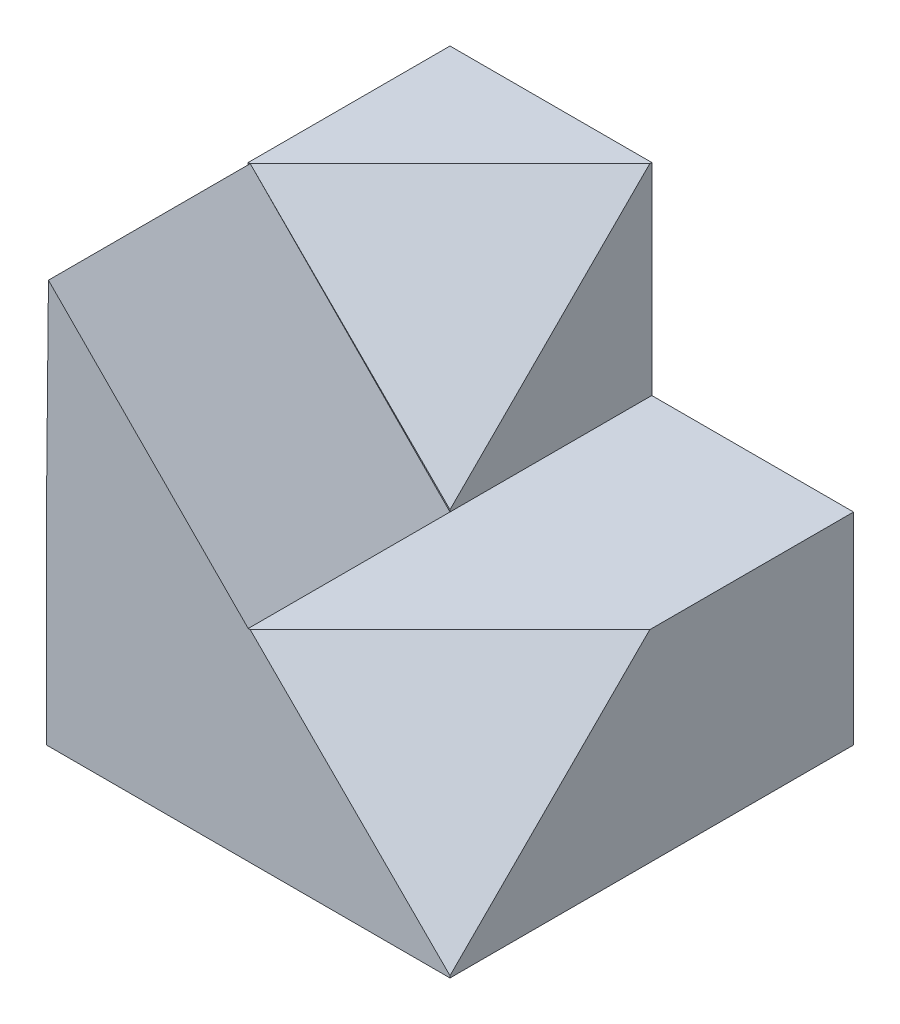
ISO-10303-21;
HEADER;
FILE_DESCRIPTION(('STEP AP214'),'2;1');
FILE_NAME('part.step','',(''),(''),'','','');
FILE_SCHEMA(('AUTOMOTIVE_DESIGN { 1 0 10303 214 1 1 1 1 }'));
ENDSEC;
DATA;
#1=APPLICATION_CONTEXT('core data for automotive mechanical design processes');
#2=APPLICATION_PROTOCOL_DEFINITION('international standard','automotive_design',2000,#1);
#3=PRODUCT_CONTEXT('',#1,'mechanical');
#4=PRODUCT('Part','Part','',(#3));
#5=PRODUCT_RELATED_PRODUCT_CATEGORY('part','',(#4));
#6=PRODUCT_DEFINITION_FORMATION('','',#4);
#7=PRODUCT_DEFINITION_CONTEXT('part definition',#1,'design');
#8=PRODUCT_DEFINITION('design','',#6,#7);
#9=PRODUCT_DEFINITION_SHAPE('','',#8);
#10=(LENGTH_UNIT() NAMED_UNIT(*) SI_UNIT(.MILLI.,.METRE.));
#11=(NAMED_UNIT(*) PLANE_ANGLE_UNIT() SI_UNIT($,.RADIAN.));
#12=(NAMED_UNIT(*) SI_UNIT($,.STERADIAN.) SOLID_ANGLE_UNIT());
#13=UNCERTAINTY_MEASURE_WITH_UNIT(LENGTH_MEASURE(1.E-05),#10,'distance_accuracy_value','');
#14=(GEOMETRIC_REPRESENTATION_CONTEXT(3) GLOBAL_UNCERTAINTY_ASSIGNED_CONTEXT((#13)) GLOBAL_UNIT_ASSIGNED_CONTEXT((#10,
#11,#12)) REPRESENTATION_CONTEXT('',''));
#15=CARTESIAN_POINT('',(0.,0.,0.));
#16=DIRECTION('',(0.,0.,1.));
#17=DIRECTION('',(1.,0.,0.));
#18=AXIS2_PLACEMENT_3D('',#15,#16,#17);
#19=CARTESIAN_POINT('',(0.,20.,0.));
#20=DIRECTION('',(0.,1.,0.));
#21=DIRECTION('',(0.,0.,1.));
#22=AXIS2_PLACEMENT_3D('',#19,#20,#21);
#23=PLANE('',#22);
#24=DIRECTION('',(1.,0.,0.));
#25=VECTOR('',#24,1.);
#26=CARTESIAN_POINT('',(-20.,20.,20.));
#27=LINE('',#26,#25);
#28=CARTESIAN_POINT('',(0.,20.,20.));
#29=VERTEX_POINT('',#28);
#30=CARTESIAN_POINT('',(0.200000000000014,20.,20.));
#31=VERTEX_POINT('',#30);
#32=EDGE_CURVE('E123',#29,#31,#27,.T.);
#33=ORIENTED_EDGE('',*,*,#32,.T.);
#34=DIRECTION('',(0.707106781186547,0.,-0.707106781186547));
#35=VECTOR('',#34,1.);
#36=CARTESIAN_POINT('',(10.1,20.,10.1));
#37=LINE('',#36,#35);
#38=CARTESIAN_POINT('',(20.,20.,0.200000000000017));
#39=VERTEX_POINT('',#38);
#40=EDGE_CURVE('E11',#31,#39,#37,.T.);
#41=ORIENTED_EDGE('',*,*,#40,.T.);
#42=DIRECTION('',(0.,0.,-1.));
#43=VECTOR('',#42,1.);
#44=CARTESIAN_POINT('',(20.,20.,-20.));
#45=LINE('',#44,#43);
#46=CARTESIAN_POINT('',(20.,20.,-20.));
#47=VERTEX_POINT('',#46);
#48=EDGE_CURVE('E146',#39,#47,#45,.T.);
#49=ORIENTED_EDGE('',*,*,#48,.T.);
#50=DIRECTION('',(-1.,0.,0.));
#51=VECTOR('',#50,1.);
#52=CARTESIAN_POINT('',(-20.,20.,-20.));
#53=LINE('',#52,#51);
#54=CARTESIAN_POINT('',(0.,20.,-20.));
#55=VERTEX_POINT('',#54);
#56=EDGE_CURVE('E133',#47,#55,#53,.T.);
#57=ORIENTED_EDGE('',*,*,#56,.T.);
#58=DIRECTION('',(0.,0.,-1.));
#59=VECTOR('',#58,1.);
#60=CARTESIAN_POINT('',(0.,20.,-20.));
#61=LINE('',#60,#59);
#62=CARTESIAN_POINT('',(0.,20.,0.));
#63=VERTEX_POINT('',#62);
#64=EDGE_CURVE('E186',#63,#55,#61,.T.);
#65=ORIENTED_EDGE('',*,*,#64,.F.);
#66=DIRECTION('',(0.,0.,1.));
#67=VECTOR('',#66,1.);
#68=CARTESIAN_POINT('',(0.,20.,0.));
#69=LINE('',#68,#67);
#70=EDGE_CURVE('E128',#63,#29,#69,.T.);
#71=ORIENTED_EDGE('',*,*,#70,.T.);
#72=EDGE_LOOP('',(#33,#41,#49,#57,#65,#71));
#73=FACE_BOUND('',#72,.T.);
#74=ADVANCED_FACE('F39',(#73),#23,.T.);
#75=CARTESIAN_POINT('',(-20.,40.,0.));
#76=DIRECTION('',(0.,0.,-1.));
#77=DIRECTION('',(-1.,0.,0.));
#78=AXIS2_PLACEMENT_3D('',#75,#76,#77);
#79=PLANE('',#78);
#80=DIRECTION('',(0.,-1.,0.));
#81=VECTOR('',#80,1.);
#82=CARTESIAN_POINT('',(-20.,40.,0.));
#83=LINE('',#82,#81);
#84=CARTESIAN_POINT('',(-20.,40.,0.));
#85=VERTEX_POINT('',#84);
#86=CARTESIAN_POINT('',(-20.,20.,0.));
#87=VERTEX_POINT('',#86);
#88=EDGE_CURVE('E141',#85,#87,#83,.T.);
#89=ORIENTED_EDGE('',*,*,#88,.T.);
#90=DIRECTION('',(-0.00999950003749681,-0.999950003749688,0.));
#91=VECTOR('',#90,1.);
#92=CARTESIAN_POINT('',(-20.,20.,0.));
#93=LINE('',#92,#91);
#94=CARTESIAN_POINT('',(-19.8,40.,0.));
#95=VERTEX_POINT('',#94);
#96=EDGE_CURVE('E210',#95,#87,#93,.T.);
#97=ORIENTED_EDGE('',*,*,#96,.F.);
#98=DIRECTION('',(1.,0.,0.));
#99=VECTOR('',#98,1.);
#100=CARTESIAN_POINT('',(-20.,40.,0.));
#101=LINE('',#100,#99);
#102=EDGE_CURVE('E169',#85,#95,#101,.T.);
#103=ORIENTED_EDGE('',*,*,#102,.F.);
#104=EDGE_LOOP('',(#89,#97,#103));
#105=FACE_BOUND('',#104,.T.);
#106=ADVANCED_FACE('F222',(#105),#79,.F.);
#107=CARTESIAN_POINT('',(0.,40.,0.));
#108=DIRECTION('',(0.,1.,0.));
#109=DIRECTION('',(0.,0.,1.));
#110=AXIS2_PLACEMENT_3D('',#107,#108,#109);
#111=PLANE('',#110);
#112=ORIENTED_EDGE('',*,*,#102,.T.);
#113=DIRECTION('',(0.707106781186547,0.,-0.707106781186547));
#114=VECTOR('',#113,1.);
#115=CARTESIAN_POINT('',(-9.9,40.,-9.9));
#116=LINE('',#115,#114);
#117=CARTESIAN_POINT('',(0.,40.,-19.8));
#118=VERTEX_POINT('',#117);
#119=EDGE_CURVE('E159',#95,#118,#116,.T.);
#120=ORIENTED_EDGE('',*,*,#119,.T.);
#121=DIRECTION('',(0.,0.,-1.));
#122=VECTOR('',#121,1.);
#123=CARTESIAN_POINT('',(0.,40.,-20.));
#124=LINE('',#123,#122);
#125=CARTESIAN_POINT('',(0.,40.,-20.));
#126=VERTEX_POINT('',#125);
#127=EDGE_CURVE('E166',#118,#126,#124,.T.);
#128=ORIENTED_EDGE('',*,*,#127,.T.);
#129=DIRECTION('',(-1.,0.,0.));
#130=VECTOR('',#129,1.);
#131=CARTESIAN_POINT('',(-20.,40.,-20.));
#132=LINE('',#131,#130);
#133=CARTESIAN_POINT('',(-20.,40.,-20.));
#134=VERTEX_POINT('',#133);
#135=EDGE_CURVE('E179',#126,#134,#132,.T.);
#136=ORIENTED_EDGE('',*,*,#135,.T.);
#137=DIRECTION('',(0.,0.,1.));
#138=VECTOR('',#137,1.);
#139=CARTESIAN_POINT('',(-20.,40.,-20.));
#140=LINE('',#139,#138);
#141=EDGE_CURVE('E182',#134,#85,#140,.T.);
#142=ORIENTED_EDGE('',*,*,#141,.T.);
#143=EDGE_LOOP('',(#112,#120,#128,#136,#142));
#144=FACE_BOUND('',#143,.T.);
#145=ADVANCED_FACE('F164',(#144),#111,.T.);
#146=CARTESIAN_POINT('',(20.,20.,-20.));
#147=DIRECTION('',(-1.,0.,0.));
#148=DIRECTION('',(0.,0.,1.));
#149=AXIS2_PLACEMENT_3D('',#146,#147,#148);
#150=PLANE('',#149);
#151=DIRECTION('',(0.,0.707106781186548,-0.707106781186547));
#152=VECTOR('',#151,1.);
#153=CARTESIAN_POINT('',(20.,30.1,-9.89999999999999));
#154=LINE('',#153,#152);
#155=CARTESIAN_POINT('',(20.,0.200000000000002,20.));
#156=VERTEX_POINT('',#155);
#157=EDGE_CURVE('E54',#156,#39,#154,.T.);
#158=ORIENTED_EDGE('',*,*,#157,.F.);
#159=DIRECTION('',(0.,-1.,0.));
#160=VECTOR('',#159,1.);
#161=CARTESIAN_POINT('',(20.,20.,20.));
#162=LINE('',#161,#160);
#163=CARTESIAN_POINT('',(20.,0.,20.));
#164=VERTEX_POINT('',#163);
#165=EDGE_CURVE('E125',#156,#164,#162,.T.);
#166=ORIENTED_EDGE('',*,*,#165,.T.);
#167=DIRECTION('',(0.,0.,-1.));
#168=VECTOR('',#167,1.);
#169=CARTESIAN_POINT('',(20.,0.,-20.));
#170=LINE('',#169,#168);
#171=CARTESIAN_POINT('',(20.,0.,-20.));
#172=VERTEX_POINT('',#171);
#173=EDGE_CURVE('E137',#164,#172,#170,.T.);
#174=ORIENTED_EDGE('',*,*,#173,.T.);
#175=DIRECTION('',(0.,-1.,0.));
#176=VECTOR('',#175,1.);
#177=CARTESIAN_POINT('',(20.,20.,-20.));
#178=LINE('',#177,#176);
#179=EDGE_CURVE('E153',#47,#172,#178,.T.);
#180=ORIENTED_EDGE('',*,*,#179,.F.);
#181=ORIENTED_EDGE('',*,*,#48,.F.);
#182=EDGE_LOOP('',(#158,#166,#174,#180,#181));
#183=FACE_BOUND('',#182,.T.);
#184=ADVANCED_FACE('F41',(#183),#150,.F.);
#185=CARTESIAN_POINT('',(-20.,20.,-20.));
#186=DIRECTION('',(0.,0.,1.));
#187=DIRECTION('',(1.,0.,0.));
#188=AXIS2_PLACEMENT_3D('',#185,#186,#187);
#189=PLANE('',#188);
#190=DIRECTION('',(-1.,0.,0.));
#191=VECTOR('',#190,1.);
#192=CARTESIAN_POINT('',(-20.,0.,-20.));
#193=LINE('',#192,#191);
#194=CARTESIAN_POINT('',(-20.,0.,-20.));
#195=VERTEX_POINT('',#194);
#196=EDGE_CURVE('E140',#172,#195,#193,.T.);
#197=ORIENTED_EDGE('',*,*,#196,.T.);
#198=DIRECTION('',(0.,-1.,0.));
#199=VECTOR('',#198,1.);
#200=CARTESIAN_POINT('',(-20.,20.,-20.));
#201=LINE('',#200,#199);
#202=EDGE_CURVE('E150',#134,#195,#201,.T.);
#203=ORIENTED_EDGE('',*,*,#202,.F.);
#204=ORIENTED_EDGE('',*,*,#135,.F.);
#205=DIRECTION('',(0.,-1.,0.));
#206=VECTOR('',#205,1.);
#207=CARTESIAN_POINT('',(0.,40.,-20.));
#208=LINE('',#207,#206);
#209=EDGE_CURVE('E177',#126,#55,#208,.T.);
#210=ORIENTED_EDGE('',*,*,#209,.T.);
#211=ORIENTED_EDGE('',*,*,#56,.F.);
#212=ORIENTED_EDGE('',*,*,#179,.T.);
#213=EDGE_LOOP('',(#197,#203,#204,#210,#211,#212));
#214=FACE_BOUND('',#213,.T.);
#215=ADVANCED_FACE('F197',(#214),#189,.F.);
#216=CARTESIAN_POINT('',(-20.,20.,-20.));
#217=DIRECTION('',(1.,0.,0.));
#218=DIRECTION('',(0.,0.,-1.));
#219=AXIS2_PLACEMENT_3D('',#216,#217,#218);
#220=PLANE('',#219);
#221=DIRECTION('',(0.,0.,1.));
#222=VECTOR('',#221,1.);
#223=CARTESIAN_POINT('',(-20.,0.,-20.));
#224=LINE('',#223,#222);
#225=CARTESIAN_POINT('',(-20.,0.,20.));
#226=VERTEX_POINT('',#225);
#227=EDGE_CURVE('E143',#195,#226,#224,.T.);
#228=ORIENTED_EDGE('',*,*,#227,.T.);
#229=DIRECTION('',(0.,-1.,0.));
#230=VECTOR('',#229,1.);
#231=CARTESIAN_POINT('',(-20.,20.,20.));
#232=LINE('',#231,#230);
#233=CARTESIAN_POINT('',(-20.,20.,20.));
#234=VERTEX_POINT('',#233);
#235=EDGE_CURVE('E131',#234,#226,#232,.T.);
#236=ORIENTED_EDGE('',*,*,#235,.F.);
#237=DIRECTION('',(0.,0.,1.));
#238=VECTOR('',#237,1.);
#239=CARTESIAN_POINT('',(-20.,20.,-20.));
#240=LINE('',#239,#238);
#241=EDGE_CURVE('E129',#87,#234,#240,.T.);
#242=ORIENTED_EDGE('',*,*,#241,.F.);
#243=ORIENTED_EDGE('',*,*,#88,.F.);
#244=ORIENTED_EDGE('',*,*,#141,.F.);
#245=ORIENTED_EDGE('',*,*,#202,.T.);
#246=EDGE_LOOP('',(#228,#236,#242,#243,#244,#245));
#247=FACE_BOUND('',#246,.T.);
#248=ADVANCED_FACE('F201',(#247),#220,.F.);
#249=CARTESIAN_POINT('',(-20.,20.,20.));
#250=DIRECTION('',(0.,0.,-1.));
#251=DIRECTION('',(-1.,0.,0.));
#252=AXIS2_PLACEMENT_3D('',#249,#250,#251);
#253=PLANE('',#252);
#254=DIRECTION('',(0.707106781186548,-0.707106781186548,0.));
#255=VECTOR('',#254,1.);
#256=CARTESIAN_POINT('',(-9.9,30.1,20.));
#257=LINE('',#256,#255);
#258=EDGE_CURVE('E47',#31,#156,#257,.T.);
#259=ORIENTED_EDGE('',*,*,#258,.F.);
#260=ORIENTED_EDGE('',*,*,#32,.F.);
#261=DIRECTION('',(-0.703544597920105,0.710651109010207,0.));
#262=VECTOR('',#261,1.);
#263=CARTESIAN_POINT('',(-19.8,40.,20.));
#264=LINE('',#263,#262);
#265=CARTESIAN_POINT('',(-19.8,40.,20.));
#266=VERTEX_POINT('',#265);
#267=EDGE_CURVE('E208',#29,#266,#264,.T.);
#268=ORIENTED_EDGE('',*,*,#267,.T.);
#269=DIRECTION('',(-0.00999950003749681,-0.999950003749688,0.));
#270=VECTOR('',#269,1.);
#271=CARTESIAN_POINT('',(-20.,20.,20.));
#272=LINE('',#271,#270);
#273=EDGE_CURVE('E211',#266,#234,#272,.T.);
#274=ORIENTED_EDGE('',*,*,#273,.T.);
#275=ORIENTED_EDGE('',*,*,#235,.T.);
#276=DIRECTION('',(1.,0.,0.));
#277=VECTOR('',#276,1.);
#278=CARTESIAN_POINT('',(-20.,0.,20.));
#279=LINE('',#278,#277);
#280=EDGE_CURVE('E145',#226,#164,#279,.T.);
#281=ORIENTED_EDGE('',*,*,#280,.T.);
#282=ORIENTED_EDGE('',*,*,#165,.F.);
#283=EDGE_LOOP('',(#259,#260,#268,#274,#275,#281,#282));
#284=FACE_BOUND('',#283,.T.);
#285=ADVANCED_FACE('F121',(#284),#253,.F.);
#286=CARTESIAN_POINT('',(0.,0.,0.));
#287=DIRECTION('',(0.,1.,0.));
#288=DIRECTION('',(0.,0.,1.));
#289=AXIS2_PLACEMENT_3D('',#286,#287,#288);
#290=PLANE('',#289);
#291=ORIENTED_EDGE('',*,*,#173,.F.);
#292=ORIENTED_EDGE('',*,*,#280,.F.);
#293=ORIENTED_EDGE('',*,*,#227,.F.);
#294=ORIENTED_EDGE('',*,*,#196,.F.);
#295=EDGE_LOOP('',(#291,#292,#293,#294));
#296=FACE_BOUND('',#295,.T.);
#297=ADVANCED_FACE('F235',(#296),#290,.F.);
#298=DIRECTION('',(0.707106781186547,-0.707106781186547,0.));
#299=VECTOR('',#298,1.);
#300=CARTESIAN_POINT('',(-19.9,40.1,0.));
#301=LINE('',#300,#299);
#302=CARTESIAN_POINT('',(0.,20.2,0.));
#303=VERTEX_POINT('',#302);
#304=EDGE_CURVE('E156',#95,#303,#301,.T.);
#305=ORIENTED_EDGE('',*,*,#304,.F.);
#306=DIRECTION('',(-0.703544597920105,0.710651109010207,0.));
#307=VECTOR('',#306,1.);
#308=CARTESIAN_POINT('',(-19.8,40.,0.));
#309=LINE('',#308,#307);
#310=EDGE_CURVE('E206',#63,#95,#309,.T.);
#311=ORIENTED_EDGE('',*,*,#310,.F.);
#312=DIRECTION('',(0.,-1.,0.));
#313=VECTOR('',#312,1.);
#314=CARTESIAN_POINT('',(0.,40.,0.));
#315=LINE('',#314,#313);
#316=EDGE_CURVE('E190',#303,#63,#315,.T.);
#317=ORIENTED_EDGE('',*,*,#316,.F.);
#318=EDGE_LOOP('',(#305,#311,#317));
#319=FACE_BOUND('',#318,.T.);
#320=ADVANCED_FACE('F225',(#319),#79,.F.);
#321=CARTESIAN_POINT('',(0.,40.,-20.));
#322=DIRECTION('',(-1.,0.,0.));
#323=DIRECTION('',(0.,0.,1.));
#324=AXIS2_PLACEMENT_3D('',#321,#322,#323);
#325=PLANE('',#324);
#326=DIRECTION('',(0.,0.707106781186547,-0.707106781186547));
#327=VECTOR('',#326,1.);
#328=CARTESIAN_POINT('',(0.,40.1,-19.9));
#329=LINE('',#328,#327);
#330=EDGE_CURVE('E61',#303,#118,#329,.T.);
#331=ORIENTED_EDGE('',*,*,#330,.F.);
#332=ORIENTED_EDGE('',*,*,#316,.T.);
#333=ORIENTED_EDGE('',*,*,#64,.T.);
#334=ORIENTED_EDGE('',*,*,#209,.F.);
#335=ORIENTED_EDGE('',*,*,#127,.F.);
#336=EDGE_LOOP('',(#331,#332,#333,#334,#335));
#337=FACE_BOUND('',#336,.T.);
#338=ADVANCED_FACE('F172',(#337),#325,.F.);
#339=CARTESIAN_POINT('',(6.73333333333333,6.73333333333333,6.73333333333333));
#340=DIRECTION('',(0.577350269189626,0.577350269189626,0.577350269189626));
#341=DIRECTION('',(0.707106781186547,0.,-0.707106781186547));
#342=AXIS2_PLACEMENT_3D('',#339,#340,#341);
#343=PLANE('',#342);
#344=ORIENTED_EDGE('',*,*,#119,.F.);
#345=ORIENTED_EDGE('',*,*,#304,.T.);
#346=ORIENTED_EDGE('',*,*,#330,.T.);
#347=EDGE_LOOP('',(#344,#345,#346));
#348=FACE_BOUND('',#347,.T.);
#349=ADVANCED_FACE('F241',(#348),#343,.T.);
#350=CARTESIAN_POINT('',(-20.,20.,0.));
#351=DIRECTION('',(-0.999950003749687,0.00999950003749681,0.));
#352=DIRECTION('',(-0.00999950003749682,-0.999950003749688,0.));
#353=AXIS2_PLACEMENT_3D('',#350,#351,#352);
#354=PLANE('',#353);
#355=ORIENTED_EDGE('',*,*,#273,.F.);
#356=DIRECTION('',(0.,0.,1.));
#357=VECTOR('',#356,1.);
#358=CARTESIAN_POINT('',(-19.8,40.,0.));
#359=LINE('',#358,#357);
#360=EDGE_CURVE('E188',#95,#266,#359,.T.);
#361=ORIENTED_EDGE('',*,*,#360,.F.);
#362=ORIENTED_EDGE('',*,*,#96,.T.);
#363=ORIENTED_EDGE('',*,*,#241,.T.);
#364=EDGE_LOOP('',(#355,#361,#362,#363));
#365=FACE_BOUND('',#364,.T.);
#366=ADVANCED_FACE('F219',(#365),#354,.T.);
#367=CARTESIAN_POINT('',(-19.8,40.,0.));
#368=DIRECTION('',(0.710651109010207,0.703544597920105,0.));
#369=DIRECTION('',(-0.703544597920105,0.710651109010207,0.));
#370=AXIS2_PLACEMENT_3D('',#367,#368,#369);
#371=PLANE('',#370);
#372=ORIENTED_EDGE('',*,*,#267,.F.);
#373=ORIENTED_EDGE('',*,*,#70,.F.);
#374=ORIENTED_EDGE('',*,*,#310,.T.);
#375=ORIENTED_EDGE('',*,*,#360,.T.);
#376=EDGE_LOOP('',(#372,#373,#374,#375));
#377=FACE_BOUND('',#376,.T.);
#378=ADVANCED_FACE('F251',(#377),#371,.T.);
#379=CARTESIAN_POINT('',(13.4,13.4,13.4));
#380=DIRECTION('',(0.577350269189626,0.577350269189626,0.577350269189626));
#381=DIRECTION('',(0.707106781186547,0.,-0.707106781186547));
#382=AXIS2_PLACEMENT_3D('',#379,#380,#381);
#383=PLANE('',#382);
#384=ORIENTED_EDGE('',*,*,#258,.T.);
#385=ORIENTED_EDGE('',*,*,#157,.T.);
#386=ORIENTED_EDGE('',*,*,#40,.F.);
#387=EDGE_LOOP('',(#384,#385,#386));
#388=FACE_BOUND('',#387,.T.);
#389=ADVANCED_FACE('F114',(#388),#383,.T.);
#390=CLOSED_SHELL('',(#74,#106,#145,#184,#215,#248,#285,#297,#320,#338,#349,#366,#378,#389));
#391=MANIFOLD_SOLID_BREP('B2',#390);
#392=ADVANCED_BREP_SHAPE_REPRESENTATION('',(#18,#391),#14);
#393=SHAPE_DEFINITION_REPRESENTATION(#9,#392);
ENDSEC;
END-ISO-10303-21;
